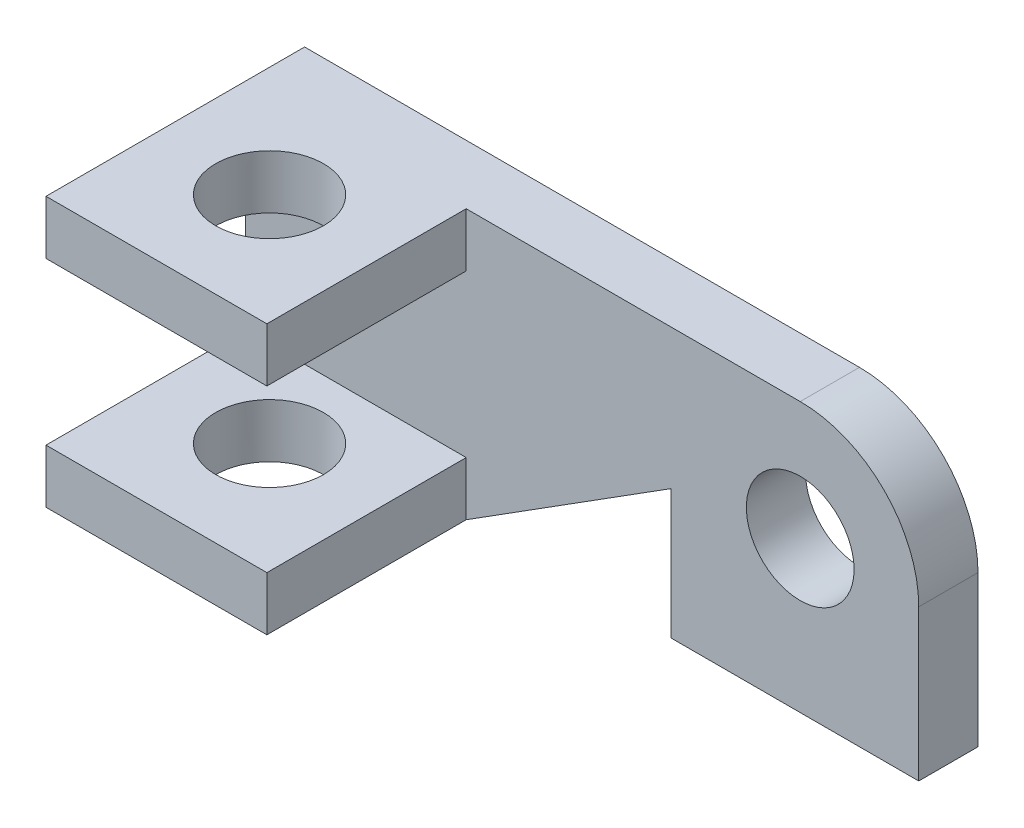
ISO-10303-21;
HEADER;
FILE_DESCRIPTION(('STEP AP214'),'2;1');
FILE_NAME('part.step','',(''),(''),'','','');
FILE_SCHEMA(('AUTOMOTIVE_DESIGN { 1 0 10303 214 1 1 1 1 }'));
ENDSEC;
DATA;
#1=APPLICATION_CONTEXT('core data for automotive mechanical design processes');
#2=APPLICATION_PROTOCOL_DEFINITION('international standard','automotive_design',2000,#1);
#3=PRODUCT_CONTEXT('',#1,'mechanical');
#4=PRODUCT('Part','Part','',(#3));
#5=PRODUCT_RELATED_PRODUCT_CATEGORY('part','',(#4));
#6=PRODUCT_DEFINITION_FORMATION('','',#4);
#7=PRODUCT_DEFINITION_CONTEXT('part definition',#1,'design');
#8=PRODUCT_DEFINITION('design','',#6,#7);
#9=PRODUCT_DEFINITION_SHAPE('','',#8);
#10=(LENGTH_UNIT() NAMED_UNIT(*) SI_UNIT(.MILLI.,.METRE.));
#11=(NAMED_UNIT(*) PLANE_ANGLE_UNIT() SI_UNIT($,.RADIAN.));
#12=(NAMED_UNIT(*) SI_UNIT($,.STERADIAN.) SOLID_ANGLE_UNIT());
#13=UNCERTAINTY_MEASURE_WITH_UNIT(LENGTH_MEASURE(1.E-05),#10,'distance_accuracy_value','');
#14=(GEOMETRIC_REPRESENTATION_CONTEXT(3) GLOBAL_UNCERTAINTY_ASSIGNED_CONTEXT((#13)) GLOBAL_UNIT_ASSIGNED_CONTEXT((#10,
#11,#12)) REPRESENTATION_CONTEXT('',''));
#15=CARTESIAN_POINT('',(0.,0.,0.));
#16=DIRECTION('',(0.,0.,1.));
#17=DIRECTION('',(1.,0.,0.));
#18=AXIS2_PLACEMENT_3D('',#15,#16,#17);
#19=CARTESIAN_POINT('',(0.,0.,11.));
#20=DIRECTION('',(0.,0.,-1.));
#21=DIRECTION('',(-1.,0.,0.));
#22=AXIS2_PLACEMENT_3D('',#19,#20,#21);
#23=PLANE('',#22);
#24=CARTESIAN_POINT('',(0.,0.,11.));
#25=DIRECTION('',(0.,0.,1.));
#26=DIRECTION('',(1.,0.,0.));
#27=AXIS2_PLACEMENT_3D('',#24,#25,#26);
#28=CIRCLE('',#27,10.);
#29=CARTESIAN_POINT('',(10.,0.,11.));
#30=VERTEX_POINT('',#29);
#31=EDGE_CURVE('E201',#30,#30,#28,.T.);
#32=ORIENTED_EDGE('',*,*,#31,.F.);
#33=EDGE_LOOP('',(#32));
#34=FACE_BOUND('',#33,.T.);
#35=DIRECTION('',(0.,1.,0.));
#36=VECTOR('',#35,1.);
#37=CARTESIAN_POINT('',(-62.,-28.,11.));
#38=LINE('',#37,#36);
#39=CARTESIAN_POINT('',(-62.,-28.,11.));
#40=VERTEX_POINT('',#39);
#41=CARTESIAN_POINT('',(-62.,-18.,11.));
#42=VERTEX_POINT('',#41);
#43=EDGE_CURVE('E160',#40,#42,#38,.T.);
#44=ORIENTED_EDGE('',*,*,#43,.F.);
#45=DIRECTION('',(0.845488903030971,0.533992991387982,0.));
#46=VECTOR('',#45,1.);
#47=CARTESIAN_POINT('',(-62.,-28.,11.));
#48=LINE('',#47,#46);
#49=CARTESIAN_POINT('',(-24.,-4.,11.));
#50=VERTEX_POINT('',#49);
#51=EDGE_CURVE('E220',#40,#50,#48,.T.);
#52=ORIENTED_EDGE('',*,*,#51,.T.);
#53=DIRECTION('',(0.,-1.,0.));
#54=VECTOR('',#53,1.);
#55=CARTESIAN_POINT('',(-24.,-4.,11.));
#56=LINE('',#55,#54);
#57=CARTESIAN_POINT('',(-24.,-28.,11.));
#58=VERTEX_POINT('',#57);
#59=EDGE_CURVE('E207',#50,#58,#56,.T.);
#60=ORIENTED_EDGE('',*,*,#59,.T.);
#61=DIRECTION('',(1.,0.,0.));
#62=VECTOR('',#61,1.);
#63=CARTESIAN_POINT('',(-24.,-28.,11.));
#64=LINE('',#63,#62);
#65=CARTESIAN_POINT('',(22.,-28.,11.));
#66=VERTEX_POINT('',#65);
#67=EDGE_CURVE('E210',#58,#66,#64,.T.);
#68=ORIENTED_EDGE('',*,*,#67,.T.);
#69=DIRECTION('',(0.,1.,0.));
#70=VECTOR('',#69,1.);
#71=CARTESIAN_POINT('',(22.,-28.,11.));
#72=LINE('',#71,#70);
#73=CARTESIAN_POINT('',(22.,0.,11.));
#74=VERTEX_POINT('',#73);
#75=EDGE_CURVE('E213',#66,#74,#72,.T.);
#76=ORIENTED_EDGE('',*,*,#75,.T.);
#77=CARTESIAN_POINT('',(0.,0.,11.));
#78=DIRECTION('',(0.,0.,1.));
#79=DIRECTION('',(-1.,0.,0.));
#80=AXIS2_PLACEMENT_3D('',#77,#78,#79);
#81=CIRCLE('',#80,22.);
#82=CARTESIAN_POINT('',(0.,22.,11.));
#83=VERTEX_POINT('',#82);
#84=EDGE_CURVE('E215',#74,#83,#81,.T.);
#85=ORIENTED_EDGE('',*,*,#84,.T.);
#86=DIRECTION('',(-1.,0.,0.));
#87=VECTOR('',#86,1.);
#88=CARTESIAN_POINT('',(0.,22.,11.));
#89=LINE('',#88,#87);
#90=CARTESIAN_POINT('',(-62.,22.,11.));
#91=VERTEX_POINT('',#90);
#92=EDGE_CURVE('E217',#83,#91,#89,.T.);
#93=ORIENTED_EDGE('',*,*,#92,.T.);
#94=DIRECTION('',(0.,1.,0.));
#95=VECTOR('',#94,1.);
#96=CARTESIAN_POINT('',(-62.,22.,11.));
#97=LINE('',#96,#95);
#98=CARTESIAN_POINT('',(-62.,12.,11.));
#99=VERTEX_POINT('',#98);
#100=EDGE_CURVE('E180',#99,#91,#97,.T.);
#101=ORIENTED_EDGE('',*,*,#100,.F.);
#102=DIRECTION('',(1.,0.,0.));
#103=VECTOR('',#102,1.);
#104=CARTESIAN_POINT('',(-103.,12.,11.));
#105=LINE('',#104,#103);
#106=CARTESIAN_POINT('',(-103.,12.,11.));
#107=VERTEX_POINT('',#106);
#108=EDGE_CURVE('E175',#107,#99,#105,.T.);
#109=ORIENTED_EDGE('',*,*,#108,.F.);
#110=DIRECTION('',(0.,-1.,0.));
#111=VECTOR('',#110,1.);
#112=CARTESIAN_POINT('',(-103.,22.,11.));
#113=LINE('',#112,#111);
#114=CARTESIAN_POINT('',(-103.,-18.,11.));
#115=VERTEX_POINT('',#114);
#116=EDGE_CURVE('E54',#107,#115,#113,.T.);
#117=ORIENTED_EDGE('',*,*,#116,.T.);
#118=DIRECTION('',(-1.,0.,0.));
#119=VECTOR('',#118,1.);
#120=CARTESIAN_POINT('',(-103.,-18.,11.));
#121=LINE('',#120,#119);
#122=EDGE_CURVE('E49',#42,#115,#121,.T.);
#123=ORIENTED_EDGE('',*,*,#122,.F.);
#124=EDGE_LOOP('',(#44,#52,#60,#68,#76,#85,#93,#101,#109,#117,#123));
#125=FACE_BOUND('',#124,.T.);
#126=ADVANCED_FACE('F33',(#34,#125),#23,.F.);
#127=CARTESIAN_POINT('',(0.,0.,0.));
#128=DIRECTION('',(0.,0.,-1.));
#129=DIRECTION('',(-1.,0.,0.));
#130=AXIS2_PLACEMENT_3D('',#127,#128,#129);
#131=PLANE('',#130);
#132=DIRECTION('',(0.,-1.,0.));
#133=VECTOR('',#132,1.);
#134=CARTESIAN_POINT('',(-24.,-4.,0.));
#135=LINE('',#134,#133);
#136=CARTESIAN_POINT('',(-24.,-4.,0.));
#137=VERTEX_POINT('',#136);
#138=CARTESIAN_POINT('',(-24.,-28.,0.));
#139=VERTEX_POINT('',#138);
#140=EDGE_CURVE('E204',#137,#139,#135,.T.);
#141=ORIENTED_EDGE('',*,*,#140,.F.);
#142=DIRECTION('',(0.845488903030971,0.533992991387982,0.));
#143=VECTOR('',#142,1.);
#144=CARTESIAN_POINT('',(-62.,-28.,0.));
#145=LINE('',#144,#143);
#146=CARTESIAN_POINT('',(-62.,-28.,0.));
#147=VERTEX_POINT('',#146);
#148=EDGE_CURVE('E211',#147,#137,#145,.T.);
#149=ORIENTED_EDGE('',*,*,#148,.F.);
#150=DIRECTION('',(1.,0.,0.));
#151=VECTOR('',#150,1.);
#152=CARTESIAN_POINT('',(-62.,-28.,0.));
#153=LINE('',#152,#151);
#154=CARTESIAN_POINT('',(-103.,-28.,0.));
#155=VERTEX_POINT('',#154);
#156=EDGE_CURVE('E234',#155,#147,#153,.T.);
#157=ORIENTED_EDGE('',*,*,#156,.F.);
#158=DIRECTION('',(0.,-1.,0.));
#159=VECTOR('',#158,1.);
#160=CARTESIAN_POINT('',(-103.,22.,0.));
#161=LINE('',#160,#159);
#162=CARTESIAN_POINT('',(-103.,22.,0.));
#163=VERTEX_POINT('',#162);
#164=EDGE_CURVE('E139',#163,#155,#161,.T.);
#165=ORIENTED_EDGE('',*,*,#164,.F.);
#166=DIRECTION('',(-1.,0.,0.));
#167=VECTOR('',#166,1.);
#168=CARTESIAN_POINT('',(0.,22.,0.));
#169=LINE('',#168,#167);
#170=CARTESIAN_POINT('',(0.,22.,0.));
#171=VERTEX_POINT('',#170);
#172=EDGE_CURVE('E231',#171,#163,#169,.T.);
#173=ORIENTED_EDGE('',*,*,#172,.F.);
#174=CARTESIAN_POINT('',(0.,0.,0.));
#175=DIRECTION('',(0.,0.,1.));
#176=DIRECTION('',(-1.,0.,0.));
#177=AXIS2_PLACEMENT_3D('',#174,#175,#176);
#178=CIRCLE('',#177,22.);
#179=CARTESIAN_POINT('',(22.,0.,0.));
#180=VERTEX_POINT('',#179);
#181=EDGE_CURVE('E229',#180,#171,#178,.T.);
#182=ORIENTED_EDGE('',*,*,#181,.F.);
#183=DIRECTION('',(0.,1.,0.));
#184=VECTOR('',#183,1.);
#185=CARTESIAN_POINT('',(22.,-28.,0.));
#186=LINE('',#185,#184);
#187=CARTESIAN_POINT('',(22.,-28.,0.));
#188=VERTEX_POINT('',#187);
#189=EDGE_CURVE('E227',#188,#180,#186,.T.);
#190=ORIENTED_EDGE('',*,*,#189,.F.);
#191=DIRECTION('',(1.,0.,0.));
#192=VECTOR('',#191,1.);
#193=CARTESIAN_POINT('',(-24.,-28.,0.));
#194=LINE('',#193,#192);
#195=EDGE_CURVE('E225',#139,#188,#194,.T.);
#196=ORIENTED_EDGE('',*,*,#195,.F.);
#197=EDGE_LOOP('',(#141,#149,#157,#165,#173,#182,#190,#196));
#198=FACE_BOUND('',#197,.T.);
#199=CARTESIAN_POINT('',(0.,0.,0.));
#200=DIRECTION('',(0.,0.,1.));
#201=DIRECTION('',(1.,0.,0.));
#202=AXIS2_PLACEMENT_3D('',#199,#200,#201);
#203=CIRCLE('',#202,10.);
#204=CARTESIAN_POINT('',(10.,0.,0.));
#205=VERTEX_POINT('',#204);
#206=EDGE_CURVE('E200',#205,#205,#203,.T.);
#207=ORIENTED_EDGE('',*,*,#206,.T.);
#208=EDGE_LOOP('',(#207));
#209=FACE_BOUND('',#208,.T.);
#210=ADVANCED_FACE('F259',(#198,#209),#131,.T.);
#211=CARTESIAN_POINT('',(-24.,-4.,11.));
#212=DIRECTION('',(1.,0.,0.));
#213=DIRECTION('',(0.,1.,0.));
#214=AXIS2_PLACEMENT_3D('',#211,#212,#213);
#215=PLANE('',#214);
#216=ORIENTED_EDGE('',*,*,#140,.T.);
#217=DIRECTION('',(0.,0.,-1.));
#218=VECTOR('',#217,1.);
#219=CARTESIAN_POINT('',(-24.,-28.,11.));
#220=LINE('',#219,#218);
#221=EDGE_CURVE('E11',#58,#139,#220,.T.);
#222=ORIENTED_EDGE('',*,*,#221,.F.);
#223=ORIENTED_EDGE('',*,*,#59,.F.);
#224=DIRECTION('',(0.,0.,-1.));
#225=VECTOR('',#224,1.);
#226=CARTESIAN_POINT('',(-24.,-4.,11.));
#227=LINE('',#226,#225);
#228=EDGE_CURVE('E222',#50,#137,#227,.T.);
#229=ORIENTED_EDGE('',*,*,#228,.T.);
#230=EDGE_LOOP('',(#216,#222,#223,#229));
#231=FACE_BOUND('',#230,.T.);
#232=ADVANCED_FACE('F35',(#231),#215,.F.);
#233=CARTESIAN_POINT('',(-24.,-28.,11.));
#234=DIRECTION('',(0.,1.,0.));
#235=DIRECTION('',(0.,0.,1.));
#236=AXIS2_PLACEMENT_3D('',#233,#234,#235);
#237=PLANE('',#236);
#238=ORIENTED_EDGE('',*,*,#195,.T.);
#239=DIRECTION('',(0.,0.,-1.));
#240=VECTOR('',#239,1.);
#241=CARTESIAN_POINT('',(22.,-28.,11.));
#242=LINE('',#241,#240);
#243=EDGE_CURVE('E42',#66,#188,#242,.T.);
#244=ORIENTED_EDGE('',*,*,#243,.F.);
#245=ORIENTED_EDGE('',*,*,#67,.F.);
#246=ORIENTED_EDGE('',*,*,#221,.T.);
#247=EDGE_LOOP('',(#238,#244,#245,#246));
#248=FACE_BOUND('',#247,.T.);
#249=ADVANCED_FACE('F291',(#248),#237,.F.);
#250=CARTESIAN_POINT('',(22.,-28.,11.));
#251=DIRECTION('',(-1.,0.,0.));
#252=DIRECTION('',(0.,0.,1.));
#253=AXIS2_PLACEMENT_3D('',#250,#251,#252);
#254=PLANE('',#253);
#255=ORIENTED_EDGE('',*,*,#189,.T.);
#256=DIRECTION('',(0.,0.,-1.));
#257=VECTOR('',#256,1.);
#258=CARTESIAN_POINT('',(22.,0.,11.));
#259=LINE('',#258,#257);
#260=EDGE_CURVE('E245',#74,#180,#259,.T.);
#261=ORIENTED_EDGE('',*,*,#260,.F.);
#262=ORIENTED_EDGE('',*,*,#75,.F.);
#263=ORIENTED_EDGE('',*,*,#243,.T.);
#264=EDGE_LOOP('',(#255,#261,#262,#263));
#265=FACE_BOUND('',#264,.T.);
#266=ADVANCED_FACE('F253',(#265),#254,.F.);
#267=CARTESIAN_POINT('',(0.,0.,11.));
#268=DIRECTION('',(0.,0.,-1.));
#269=DIRECTION('',(-1.,0.,0.));
#270=AXIS2_PLACEMENT_3D('',#267,#268,#269);
#271=CYLINDRICAL_SURFACE('',#270,22.);
#272=ORIENTED_EDGE('',*,*,#181,.T.);
#273=DIRECTION('',(0.,0.,-1.));
#274=VECTOR('',#273,1.);
#275=CARTESIAN_POINT('',(0.,22.,11.));
#276=LINE('',#275,#274);
#277=EDGE_CURVE('E242',#83,#171,#276,.T.);
#278=ORIENTED_EDGE('',*,*,#277,.F.);
#279=ORIENTED_EDGE('',*,*,#84,.F.);
#280=ORIENTED_EDGE('',*,*,#260,.T.);
#281=EDGE_LOOP('',(#272,#278,#279,#280));
#282=FACE_BOUND('',#281,.T.);
#283=ADVANCED_FACE('F264',(#282),#271,.T.);
#284=CARTESIAN_POINT('',(0.,22.,11.));
#285=DIRECTION('',(0.,-1.,0.));
#286=DIRECTION('',(1.,0.,0.));
#287=AXIS2_PLACEMENT_3D('',#284,#285,#286);
#288=PLANE('',#287);
#289=CARTESIAN_POINT('',(-82.5,22.,27.));
#290=DIRECTION('',(0.,-1.,0.));
#291=DIRECTION('',(1.,0.,0.));
#292=AXIS2_PLACEMENT_3D('',#289,#290,#291);
#293=CIRCLE('',#292,9.99999999999999);
#294=CARTESIAN_POINT('',(-72.5,22.,27.));
#295=VERTEX_POINT('',#294);
#296=EDGE_CURVE('E470',#295,#295,#293,.T.);
#297=ORIENTED_EDGE('',*,*,#296,.T.);
#298=EDGE_LOOP('',(#297));
#299=FACE_BOUND('',#298,.T.);
#300=ORIENTED_EDGE('',*,*,#172,.T.);
#301=DIRECTION('',(0.,0.,-1.));
#302=VECTOR('',#301,1.);
#303=CARTESIAN_POINT('',(-103.,22.,11.));
#304=LINE('',#303,#302);
#305=CARTESIAN_POINT('',(-103.,22.,48.));
#306=VERTEX_POINT('',#305);
#307=EDGE_CURVE('E142',#306,#163,#304,.T.);
#308=ORIENTED_EDGE('',*,*,#307,.F.);
#309=DIRECTION('',(-1.,0.,0.));
#310=VECTOR('',#309,1.);
#311=CARTESIAN_POINT('',(-103.,22.,48.));
#312=LINE('',#311,#310);
#313=CARTESIAN_POINT('',(-62.,22.,48.));
#314=VERTEX_POINT('',#313);
#315=EDGE_CURVE('E184',#314,#306,#312,.T.);
#316=ORIENTED_EDGE('',*,*,#315,.F.);
#317=DIRECTION('',(0.,0.,-1.));
#318=VECTOR('',#317,1.);
#319=CARTESIAN_POINT('',(-62.,22.,48.));
#320=LINE('',#319,#318);
#321=EDGE_CURVE('E187',#314,#91,#320,.T.);
#322=ORIENTED_EDGE('',*,*,#321,.T.);
#323=ORIENTED_EDGE('',*,*,#92,.F.);
#324=ORIENTED_EDGE('',*,*,#277,.T.);
#325=EDGE_LOOP('',(#300,#308,#316,#322,#323,#324));
#326=FACE_BOUND('',#325,.T.);
#327=ADVANCED_FACE('F268',(#299,#326),#288,.F.);
#328=CARTESIAN_POINT('',(-103.,22.,11.));
#329=DIRECTION('',(1.,0.,0.));
#330=DIRECTION('',(0.,0.,-1.));
#331=AXIS2_PLACEMENT_3D('',#328,#329,#330);
#332=PLANE('',#331);
#333=ORIENTED_EDGE('',*,*,#164,.T.);
#334=DIRECTION('',(0.,0.,-1.));
#335=VECTOR('',#334,1.);
#336=CARTESIAN_POINT('',(-103.,-28.,11.));
#337=LINE('',#336,#335);
#338=CARTESIAN_POINT('',(-103.,-28.,48.));
#339=VERTEX_POINT('',#338);
#340=EDGE_CURVE('E131',#339,#155,#337,.T.);
#341=ORIENTED_EDGE('',*,*,#340,.F.);
#342=DIRECTION('',(0.,-1.,0.));
#343=VECTOR('',#342,1.);
#344=CARTESIAN_POINT('',(-103.,-28.,48.));
#345=LINE('',#344,#343);
#346=CARTESIAN_POINT('',(-103.,-18.,48.));
#347=VERTEX_POINT('',#346);
#348=EDGE_CURVE('E136',#347,#339,#345,.T.);
#349=ORIENTED_EDGE('',*,*,#348,.F.);
#350=DIRECTION('',(0.,0.,-1.));
#351=VECTOR('',#350,1.);
#352=CARTESIAN_POINT('',(-103.,-18.,48.));
#353=LINE('',#352,#351);
#354=EDGE_CURVE('E168',#347,#115,#353,.T.);
#355=ORIENTED_EDGE('',*,*,#354,.T.);
#356=ORIENTED_EDGE('',*,*,#116,.F.);
#357=DIRECTION('',(0.,0.,-1.));
#358=VECTOR('',#357,1.);
#359=CARTESIAN_POINT('',(-103.,12.,48.));
#360=LINE('',#359,#358);
#361=CARTESIAN_POINT('',(-103.,12.,48.));
#362=VERTEX_POINT('',#361);
#363=EDGE_CURVE('E197',#362,#107,#360,.T.);
#364=ORIENTED_EDGE('',*,*,#363,.F.);
#365=DIRECTION('',(0.,-1.,0.));
#366=VECTOR('',#365,1.);
#367=CARTESIAN_POINT('',(-103.,22.,48.));
#368=LINE('',#367,#366);
#369=EDGE_CURVE('E176',#306,#362,#368,.T.);
#370=ORIENTED_EDGE('',*,*,#369,.F.);
#371=ORIENTED_EDGE('',*,*,#307,.T.);
#372=EDGE_LOOP('',(#333,#341,#349,#355,#356,#364,#370,#371));
#373=FACE_BOUND('',#372,.T.);
#374=ADVANCED_FACE('F133',(#373),#332,.F.);
#375=CARTESIAN_POINT('',(-62.,-28.,11.));
#376=DIRECTION('',(0.,1.,0.));
#377=DIRECTION('',(-1.,0.,0.));
#378=AXIS2_PLACEMENT_3D('',#375,#376,#377);
#379=PLANE('',#378);
#380=CARTESIAN_POINT('',(-82.5,-28.,27.));
#381=DIRECTION('',(0.,-1.,0.));
#382=DIRECTION('',(1.,0.,0.));
#383=AXIS2_PLACEMENT_3D('',#380,#381,#382);
#384=CIRCLE('',#383,9.99999999999999);
#385=CARTESIAN_POINT('',(-72.5,-28.,27.));
#386=VERTEX_POINT('',#385);
#387=EDGE_CURVE('E475',#386,#386,#384,.T.);
#388=ORIENTED_EDGE('',*,*,#387,.F.);
#389=EDGE_LOOP('',(#388));
#390=FACE_BOUND('',#389,.T.);
#391=ORIENTED_EDGE('',*,*,#156,.T.);
#392=DIRECTION('',(0.,0.,-1.));
#393=VECTOR('',#392,1.);
#394=CARTESIAN_POINT('',(-62.,-28.,11.));
#395=LINE('',#394,#393);
#396=EDGE_CURVE('E143',#40,#147,#395,.T.);
#397=ORIENTED_EDGE('',*,*,#396,.F.);
#398=DIRECTION('',(0.,0.,-1.));
#399=VECTOR('',#398,1.);
#400=CARTESIAN_POINT('',(-62.,-28.,48.));
#401=LINE('',#400,#399);
#402=CARTESIAN_POINT('',(-62.,-28.,48.));
#403=VERTEX_POINT('',#402);
#404=EDGE_CURVE('E150',#403,#40,#401,.T.);
#405=ORIENTED_EDGE('',*,*,#404,.F.);
#406=DIRECTION('',(1.,0.,0.));
#407=VECTOR('',#406,1.);
#408=CARTESIAN_POINT('',(-103.,-28.,48.));
#409=LINE('',#408,#407);
#410=EDGE_CURVE('E146',#339,#403,#409,.T.);
#411=ORIENTED_EDGE('',*,*,#410,.F.);
#412=ORIENTED_EDGE('',*,*,#340,.T.);
#413=EDGE_LOOP('',(#391,#397,#405,#411,#412));
#414=FACE_BOUND('',#413,.T.);
#415=ADVANCED_FACE('F147',(#390,#414),#379,.F.);
#416=CARTESIAN_POINT('',(-62.,-28.,11.));
#417=DIRECTION('',(-0.533992991387982,0.845488903030971,0.));
#418=DIRECTION('',(-0.845488903030971,-0.533992991387982,0.));
#419=AXIS2_PLACEMENT_3D('',#416,#417,#418);
#420=PLANE('',#419);
#421=ORIENTED_EDGE('',*,*,#148,.T.);
#422=ORIENTED_EDGE('',*,*,#228,.F.);
#423=ORIENTED_EDGE('',*,*,#51,.F.);
#424=ORIENTED_EDGE('',*,*,#396,.T.);
#425=EDGE_LOOP('',(#421,#422,#423,#424));
#426=FACE_BOUND('',#425,.T.);
#427=ADVANCED_FACE('F288',(#426),#420,.F.);
#428=CARTESIAN_POINT('',(0.,0.,11.));
#429=DIRECTION('',(0.,0.,-1.));
#430=DIRECTION('',(-1.,0.,0.));
#431=AXIS2_PLACEMENT_3D('',#428,#429,#430);
#432=CYLINDRICAL_SURFACE('',#431,10.);
#433=ORIENTED_EDGE('',*,*,#31,.T.);
#434=EDGE_LOOP('',(#433));
#435=FACE_BOUND('',#434,.T.);
#436=ORIENTED_EDGE('',*,*,#206,.F.);
#437=EDGE_LOOP('',(#436));
#438=FACE_BOUND('',#437,.T.);
#439=ADVANCED_FACE('F307',(#435,#438),#432,.F.);
#440=CARTESIAN_POINT('',(-103.,12.,48.));
#441=DIRECTION('',(0.,1.,0.));
#442=DIRECTION('',(0.,0.,1.));
#443=AXIS2_PLACEMENT_3D('',#440,#441,#442);
#444=PLANE('',#443);
#445=CARTESIAN_POINT('',(-82.5,12.,27.));
#446=DIRECTION('',(0.,1.,0.));
#447=DIRECTION('',(0.,0.,1.));
#448=AXIS2_PLACEMENT_3D('',#445,#446,#447);
#449=CIRCLE('',#448,9.99999999999999);
#450=CARTESIAN_POINT('',(-82.5,12.,37.));
#451=VERTEX_POINT('',#450);
#452=EDGE_CURVE('E163',#451,#451,#449,.T.);
#453=ORIENTED_EDGE('',*,*,#452,.T.);
#454=EDGE_LOOP('',(#453));
#455=FACE_BOUND('',#454,.T.);
#456=ORIENTED_EDGE('',*,*,#108,.T.);
#457=DIRECTION('',(0.,0.,-1.));
#458=VECTOR('',#457,1.);
#459=CARTESIAN_POINT('',(-62.,12.,48.));
#460=LINE('',#459,#458);
#461=CARTESIAN_POINT('',(-62.,12.,48.));
#462=VERTEX_POINT('',#461);
#463=EDGE_CURVE('E194',#462,#99,#460,.T.);
#464=ORIENTED_EDGE('',*,*,#463,.F.);
#465=DIRECTION('',(1.,0.,0.));
#466=VECTOR('',#465,1.);
#467=CARTESIAN_POINT('',(-103.,12.,48.));
#468=LINE('',#467,#466);
#469=EDGE_CURVE('E179',#362,#462,#468,.T.);
#470=ORIENTED_EDGE('',*,*,#469,.F.);
#471=ORIENTED_EDGE('',*,*,#363,.T.);
#472=EDGE_LOOP('',(#456,#464,#470,#471));
#473=FACE_BOUND('',#472,.T.);
#474=ADVANCED_FACE('F276',(#455,#473),#444,.F.);
#475=CARTESIAN_POINT('',(-62.,22.,48.));
#476=DIRECTION('',(-1.,0.,0.));
#477=DIRECTION('',(0.,0.,1.));
#478=AXIS2_PLACEMENT_3D('',#475,#476,#477);
#479=PLANE('',#478);
#480=ORIENTED_EDGE('',*,*,#100,.T.);
#481=ORIENTED_EDGE('',*,*,#321,.F.);
#482=DIRECTION('',(0.,1.,0.));
#483=VECTOR('',#482,1.);
#484=CARTESIAN_POINT('',(-62.,22.,48.));
#485=LINE('',#484,#483);
#486=EDGE_CURVE('E182',#462,#314,#485,.T.);
#487=ORIENTED_EDGE('',*,*,#486,.F.);
#488=ORIENTED_EDGE('',*,*,#463,.T.);
#489=EDGE_LOOP('',(#480,#481,#487,#488));
#490=FACE_BOUND('',#489,.T.);
#491=ADVANCED_FACE('F272',(#490),#479,.F.);
#492=CARTESIAN_POINT('',(0.,0.,48.));
#493=DIRECTION('',(0.,0.,1.));
#494=DIRECTION('',(1.,0.,0.));
#495=AXIS2_PLACEMENT_3D('',#492,#493,#494);
#496=PLANE('',#495);
#497=ORIENTED_EDGE('',*,*,#369,.T.);
#498=ORIENTED_EDGE('',*,*,#469,.T.);
#499=ORIENTED_EDGE('',*,*,#486,.T.);
#500=ORIENTED_EDGE('',*,*,#315,.T.);
#501=EDGE_LOOP('',(#497,#498,#499,#500));
#502=FACE_BOUND('',#501,.T.);
#503=ADVANCED_FACE('F361',(#502),#496,.T.);
#504=CARTESIAN_POINT('',(-62.,-28.,48.));
#505=DIRECTION('',(-1.,0.,0.));
#506=DIRECTION('',(0.,0.,1.));
#507=AXIS2_PLACEMENT_3D('',#504,#505,#506);
#508=PLANE('',#507);
#509=ORIENTED_EDGE('',*,*,#43,.T.);
#510=DIRECTION('',(0.,0.,-1.));
#511=VECTOR('',#510,1.);
#512=CARTESIAN_POINT('',(-62.,-18.,48.));
#513=LINE('',#512,#511);
#514=CARTESIAN_POINT('',(-62.,-18.,48.));
#515=VERTEX_POINT('',#514);
#516=EDGE_CURVE('E171',#515,#42,#513,.T.);
#517=ORIENTED_EDGE('',*,*,#516,.F.);
#518=DIRECTION('',(0.,1.,0.));
#519=VECTOR('',#518,1.);
#520=CARTESIAN_POINT('',(-62.,-28.,48.));
#521=LINE('',#520,#519);
#522=EDGE_CURVE('E153',#403,#515,#521,.T.);
#523=ORIENTED_EDGE('',*,*,#522,.F.);
#524=ORIENTED_EDGE('',*,*,#404,.T.);
#525=EDGE_LOOP('',(#509,#517,#523,#524));
#526=FACE_BOUND('',#525,.T.);
#527=ADVANCED_FACE('F283',(#526),#508,.F.);
#528=CARTESIAN_POINT('',(-103.,-18.,48.));
#529=DIRECTION('',(0.,-1.,0.));
#530=DIRECTION('',(0.,0.,-1.));
#531=AXIS2_PLACEMENT_3D('',#528,#529,#530);
#532=PLANE('',#531);
#533=CARTESIAN_POINT('',(-82.5,-18.,27.));
#534=DIRECTION('',(0.,-1.,0.));
#535=DIRECTION('',(0.,0.,-1.));
#536=AXIS2_PLACEMENT_3D('',#533,#534,#535);
#537=CIRCLE('',#536,9.99999999999999);
#538=CARTESIAN_POINT('',(-82.5,-18.,17.));
#539=VERTEX_POINT('',#538);
#540=EDGE_CURVE('E37',#539,#539,#537,.T.);
#541=ORIENTED_EDGE('',*,*,#540,.T.);
#542=EDGE_LOOP('',(#541));
#543=FACE_BOUND('',#542,.T.);
#544=ORIENTED_EDGE('',*,*,#122,.T.);
#545=ORIENTED_EDGE('',*,*,#354,.F.);
#546=DIRECTION('',(-1.,0.,0.));
#547=VECTOR('',#546,1.);
#548=CARTESIAN_POINT('',(-103.,-18.,48.));
#549=LINE('',#548,#547);
#550=EDGE_CURVE('E157',#515,#347,#549,.T.);
#551=ORIENTED_EDGE('',*,*,#550,.F.);
#552=ORIENTED_EDGE('',*,*,#516,.T.);
#553=EDGE_LOOP('',(#544,#545,#551,#552));
#554=FACE_BOUND('',#553,.T.);
#555=ADVANCED_FACE('F280',(#543,#554),#532,.F.);
#556=CARTESIAN_POINT('',(0.,0.,48.));
#557=DIRECTION('',(0.,0.,-1.));
#558=DIRECTION('',(-1.,0.,0.));
#559=AXIS2_PLACEMENT_3D('',#556,#557,#558);
#560=PLANE('',#559);
#561=ORIENTED_EDGE('',*,*,#348,.T.);
#562=ORIENTED_EDGE('',*,*,#410,.T.);
#563=ORIENTED_EDGE('',*,*,#522,.T.);
#564=ORIENTED_EDGE('',*,*,#550,.T.);
#565=EDGE_LOOP('',(#561,#562,#563,#564));
#566=FACE_BOUND('',#565,.T.);
#567=ADVANCED_FACE('F155',(#566),#560,.F.);
#568=CARTESIAN_POINT('',(-82.5,22.,27.));
#569=DIRECTION('',(0.,-1.,0.));
#570=DIRECTION('',(1.,0.,0.));
#571=AXIS2_PLACEMENT_3D('',#568,#569,#570);
#572=CYLINDRICAL_SURFACE('',#571,9.99999999999999);
#573=ORIENTED_EDGE('',*,*,#387,.T.);
#574=EDGE_LOOP('',(#573));
#575=FACE_BOUND('',#574,.T.);
#576=ORIENTED_EDGE('',*,*,#540,.F.);
#577=EDGE_LOOP('',(#576));
#578=FACE_BOUND('',#577,.T.);
#579=ADVANCED_FACE('F387',(#575,#578),#572,.F.);
#580=ORIENTED_EDGE('',*,*,#296,.F.);
#581=EDGE_LOOP('',(#580));
#582=FACE_BOUND('',#581,.T.);
#583=ORIENTED_EDGE('',*,*,#452,.F.);
#584=EDGE_LOOP('',(#583));
#585=FACE_BOUND('',#584,.T.);
#586=ADVANCED_FACE('F393',(#582,#585),#572,.F.);
#587=CLOSED_SHELL('',(#126,#210,#232,#249,#266,#283,#327,#374,#415,#427,#439,#474,#491,#503,
#527,#555,#567,#579,#586));
#588=MANIFOLD_SOLID_BREP('B2',#587);
#589=ADVANCED_BREP_SHAPE_REPRESENTATION('',(#18,#588),#14);
#590=SHAPE_DEFINITION_REPRESENTATION(#9,#589);
ENDSEC;
END-ISO-10303-21;
